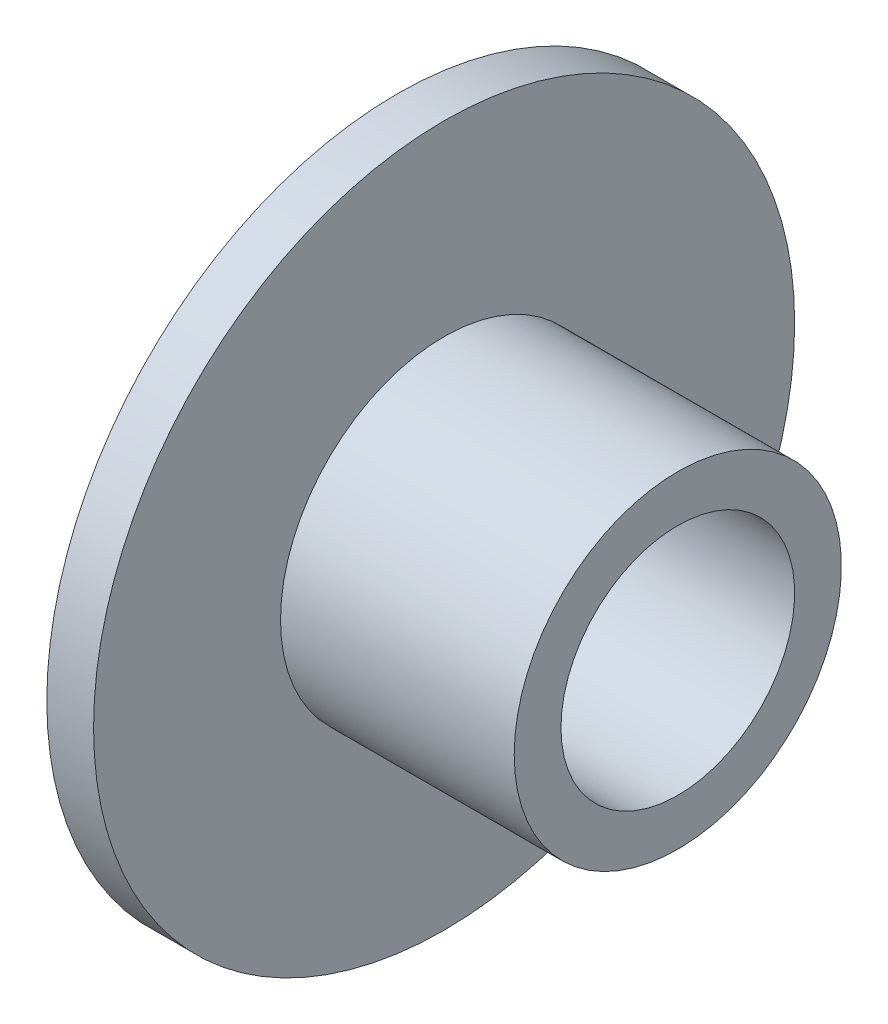
ISO-10303-21;
HEADER;
FILE_DESCRIPTION(('STEP AP214'),'2;1');
FILE_NAME('part.step','',(''),(''),'','','');
FILE_SCHEMA(('AUTOMOTIVE_DESIGN { 1 0 10303 214 1 1 1 1 }'));
ENDSEC;
DATA;
#1=APPLICATION_CONTEXT('core data for automotive mechanical design processes');
#2=APPLICATION_PROTOCOL_DEFINITION('international standard','automotive_design',2000,#1);
#3=PRODUCT_CONTEXT('',#1,'mechanical');
#4=PRODUCT('Part','Part','',(#3));
#5=PRODUCT_RELATED_PRODUCT_CATEGORY('part','',(#4));
#6=PRODUCT_DEFINITION_FORMATION('','',#4);
#7=PRODUCT_DEFINITION_CONTEXT('part definition',#1,'design');
#8=PRODUCT_DEFINITION('design','',#6,#7);
#9=PRODUCT_DEFINITION_SHAPE('','',#8);
#10=(LENGTH_UNIT() NAMED_UNIT(*) SI_UNIT(.MILLI.,.METRE.));
#11=(NAMED_UNIT(*) PLANE_ANGLE_UNIT() SI_UNIT($,.RADIAN.));
#12=(NAMED_UNIT(*) SI_UNIT($,.STERADIAN.) SOLID_ANGLE_UNIT());
#13=UNCERTAINTY_MEASURE_WITH_UNIT(LENGTH_MEASURE(1.E-05),#10,'distance_accuracy_value','');
#14=(GEOMETRIC_REPRESENTATION_CONTEXT(3) GLOBAL_UNCERTAINTY_ASSIGNED_CONTEXT((#13)) GLOBAL_UNIT_ASSIGNED_CONTEXT((#10,
#11,#12)) REPRESENTATION_CONTEXT('',''));
#15=CARTESIAN_POINT('',(0.,0.,0.));
#16=DIRECTION('',(0.,0.,1.));
#17=DIRECTION('',(1.,0.,0.));
#18=AXIS2_PLACEMENT_3D('',#15,#16,#17);
#19=CARTESIAN_POINT('',(22.5859668470207,0.,-2.43401550146037));
#20=DIRECTION('',(-1.,0.,0.));
#21=DIRECTION('',(0.,0.,1.));
#22=AXIS2_PLACEMENT_3D('',#19,#20,#21);
#23=CYLINDRICAL_SURFACE('',#22,15.);
#24=CARTESIAN_POINT('',(22.5859668470207,0.,-2.43401550146037));
#25=DIRECTION('',(-1.,0.,0.));
#26=DIRECTION('',(0.,0.,1.));
#27=AXIS2_PLACEMENT_3D('',#24,#25,#26);
#28=CIRCLE('',#27,15.);
#29=CARTESIAN_POINT('',(22.5859668470207,0.,12.5659844985396));
#30=VERTEX_POINT('',#29);
#31=EDGE_CURVE('E10',#30,#30,#28,.T.);
#32=ORIENTED_EDGE('',*,*,#31,.F.);
#33=EDGE_LOOP('',(#32));
#34=FACE_BOUND('',#33,.T.);
#35=CARTESIAN_POINT('',(24.5859668470207,0.,-2.43401550146037));
#36=DIRECTION('',(-1.,0.,0.));
#37=DIRECTION('',(0.,0.,1.));
#38=AXIS2_PLACEMENT_3D('',#35,#36,#37);
#39=CIRCLE('',#38,15.);
#40=CARTESIAN_POINT('',(24.5859668470207,0.,12.5659844985396));
#41=VERTEX_POINT('',#40);
#42=EDGE_CURVE('E48',#41,#41,#39,.T.);
#43=ORIENTED_EDGE('',*,*,#42,.T.);
#44=EDGE_LOOP('',(#43));
#45=FACE_BOUND('',#44,.T.);
#46=ADVANCED_FACE('F41',(#34,#45),#23,.T.);
#47=CARTESIAN_POINT('',(24.5859668470207,0.,-17.4340155014604));
#48=DIRECTION('',(-1.,0.,0.));
#49=DIRECTION('',(0.,0.,1.));
#50=AXIS2_PLACEMENT_3D('',#47,#48,#49);
#51=PLANE('',#50);
#52=ORIENTED_EDGE('',*,*,#42,.F.);
#53=EDGE_LOOP('',(#52));
#54=FACE_BOUND('',#53,.T.);
#55=CARTESIAN_POINT('',(24.5859668470207,0.,-2.43401550146037));
#56=DIRECTION('',(-1.,0.,0.));
#57=DIRECTION('',(0.,0.,1.));
#58=AXIS2_PLACEMENT_3D('',#55,#56,#57);
#59=CIRCLE('',#58,7.);
#60=CARTESIAN_POINT('',(24.5859668470207,0.,4.56598449853963));
#61=VERTEX_POINT('',#60);
#62=EDGE_CURVE('E53',#61,#61,#59,.T.);
#63=ORIENTED_EDGE('',*,*,#62,.T.);
#64=EDGE_LOOP('',(#63));
#65=FACE_BOUND('',#64,.T.);
#66=ADVANCED_FACE('F85',(#54,#65),#51,.F.);
#67=CARTESIAN_POINT('',(22.5859668470207,0.,-2.43401550146037));
#68=DIRECTION('',(-1.,0.,0.));
#69=DIRECTION('',(0.,0.,1.));
#70=AXIS2_PLACEMENT_3D('',#67,#68,#69);
#71=CYLINDRICAL_SURFACE('',#70,7.);
#72=ORIENTED_EDGE('',*,*,#62,.F.);
#73=EDGE_LOOP('',(#72));
#74=FACE_BOUND('',#73,.T.);
#75=CARTESIAN_POINT('',(34.5859668470207,0.,-2.43401550146037));
#76=DIRECTION('',(-1.,0.,0.));
#77=DIRECTION('',(0.,0.,1.));
#78=AXIS2_PLACEMENT_3D('',#75,#76,#77);
#79=CIRCLE('',#78,7.);
#80=CARTESIAN_POINT('',(34.5859668470207,0.,4.56598449853963));
#81=VERTEX_POINT('',#80);
#82=EDGE_CURVE('E58',#81,#81,#79,.T.);
#83=ORIENTED_EDGE('',*,*,#82,.T.);
#84=EDGE_LOOP('',(#83));
#85=FACE_BOUND('',#84,.T.);
#86=ADVANCED_FACE('F90',(#74,#85),#71,.T.);
#87=CARTESIAN_POINT('',(34.5859668470207,0.,-7.43401550146037));
#88=DIRECTION('',(-1.,0.,0.));
#89=DIRECTION('',(0.,0.,1.));
#90=AXIS2_PLACEMENT_3D('',#87,#88,#89);
#91=PLANE('',#90);
#92=ORIENTED_EDGE('',*,*,#82,.F.);
#93=EDGE_LOOP('',(#92));
#94=FACE_BOUND('',#93,.T.);
#95=CARTESIAN_POINT('',(34.5859668470207,0.,-2.43401550146037));
#96=DIRECTION('',(-1.,0.,0.));
#97=DIRECTION('',(0.,0.,1.));
#98=AXIS2_PLACEMENT_3D('',#95,#96,#97);
#99=CIRCLE('',#98,5.);
#100=CARTESIAN_POINT('',(34.5859668470207,0.,2.56598449853963));
#101=VERTEX_POINT('',#100);
#102=EDGE_CURVE('E64',#101,#101,#99,.T.);
#103=ORIENTED_EDGE('',*,*,#102,.T.);
#104=EDGE_LOOP('',(#103));
#105=FACE_BOUND('',#104,.T.);
#106=ADVANCED_FACE('F81',(#94,#105),#91,.F.);
#107=CARTESIAN_POINT('',(22.5859668470207,0.,-2.43401550146037));
#108=DIRECTION('',(-1.,0.,0.));
#109=DIRECTION('',(0.,0.,1.));
#110=AXIS2_PLACEMENT_3D('',#107,#108,#109);
#111=CYLINDRICAL_SURFACE('',#110,5.);
#112=ORIENTED_EDGE('',*,*,#102,.F.);
#113=EDGE_LOOP('',(#112));
#114=FACE_BOUND('',#113,.T.);
#115=CARTESIAN_POINT('',(22.5859668470207,0.,-2.43401550146037));
#116=DIRECTION('',(-1.,0.,0.));
#117=DIRECTION('',(0.,0.,1.));
#118=AXIS2_PLACEMENT_3D('',#115,#116,#117);
#119=CIRCLE('',#118,5.);
#120=CARTESIAN_POINT('',(22.5859668470207,0.,2.56598449853963));
#121=VERTEX_POINT('',#120);
#122=EDGE_CURVE('E68',#121,#121,#119,.T.);
#123=ORIENTED_EDGE('',*,*,#122,.T.);
#124=EDGE_LOOP('',(#123));
#125=FACE_BOUND('',#124,.T.);
#126=ADVANCED_FACE('F73',(#114,#125),#111,.F.);
#127=CARTESIAN_POINT('',(22.5859668470207,0.,-15.4340155014604));
#128=DIRECTION('',(1.,0.,0.));
#129=DIRECTION('',(0.,0.,-1.));
#130=AXIS2_PLACEMENT_3D('',#127,#128,#129);
#131=PLANE('',#130);
#132=ORIENTED_EDGE('',*,*,#122,.F.);
#133=EDGE_LOOP('',(#132));
#134=FACE_BOUND('',#133,.T.);
#135=ORIENTED_EDGE('',*,*,#31,.T.);
#136=EDGE_LOOP('',(#135));
#137=FACE_BOUND('',#136,.T.);
#138=ADVANCED_FACE('F75',(#134,#137),#131,.F.);
#139=CLOSED_SHELL('',(#46,#66,#86,#106,#126,#138));
#140=MANIFOLD_SOLID_BREP('B2',#139);
#141=ADVANCED_BREP_SHAPE_REPRESENTATION('',(#18,#140),#14);
#142=SHAPE_DEFINITION_REPRESENTATION(#9,#141);
ENDSEC;
END-ISO-10303-21;
